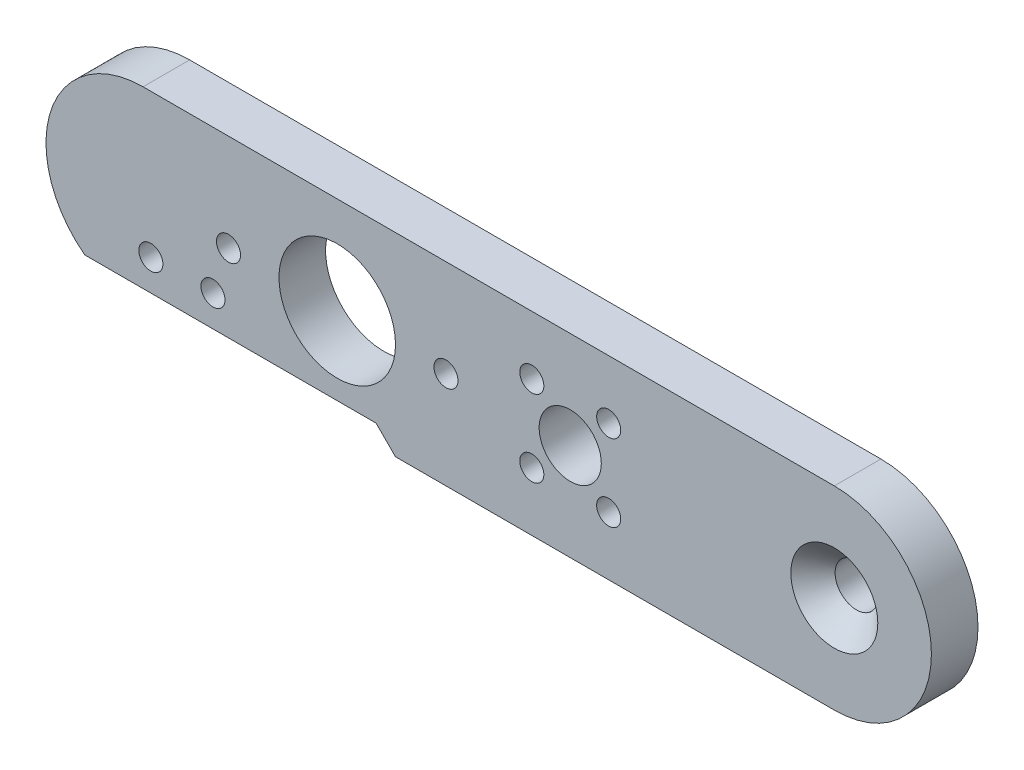
ISO-10303-21;
HEADER;
FILE_DESCRIPTION(('STEP AP214'),'2;1');
FILE_NAME('part.step','',(''),(''),'','','');
FILE_SCHEMA(('AUTOMOTIVE_DESIGN { 1 0 10303 214 1 1 1 1 }'));
ENDSEC;
DATA;
#1=APPLICATION_CONTEXT('core data for automotive mechanical design processes');
#2=APPLICATION_PROTOCOL_DEFINITION('international standard','automotive_design',2000,#1);
#3=PRODUCT_CONTEXT('',#1,'mechanical');
#4=PRODUCT('Part','Part','',(#3));
#5=PRODUCT_RELATED_PRODUCT_CATEGORY('part','',(#4));
#6=PRODUCT_DEFINITION_FORMATION('','',#4);
#7=PRODUCT_DEFINITION_CONTEXT('part definition',#1,'design');
#8=PRODUCT_DEFINITION('design','',#6,#7);
#9=PRODUCT_DEFINITION_SHAPE('','',#8);
#10=(LENGTH_UNIT() NAMED_UNIT(*) SI_UNIT(.MILLI.,.METRE.));
#11=(NAMED_UNIT(*) PLANE_ANGLE_UNIT() SI_UNIT($,.RADIAN.));
#12=(NAMED_UNIT(*) SI_UNIT($,.STERADIAN.) SOLID_ANGLE_UNIT());
#13=UNCERTAINTY_MEASURE_WITH_UNIT(LENGTH_MEASURE(1.E-05),#10,'distance_accuracy_value','');
#14=(GEOMETRIC_REPRESENTATION_CONTEXT(3) GLOBAL_UNCERTAINTY_ASSIGNED_CONTEXT((#13)) GLOBAL_UNIT_ASSIGNED_CONTEXT((#10,
#11,#12)) REPRESENTATION_CONTEXT('',''));
#15=CARTESIAN_POINT('',(0.,0.,0.));
#16=DIRECTION('',(0.,0.,1.));
#17=DIRECTION('',(1.,0.,0.));
#18=AXIS2_PLACEMENT_3D('',#15,#16,#17);
#19=CARTESIAN_POINT('',(-44.5692068429238,0.,6.));
#20=DIRECTION('',(0.,0.,1.));
#21=DIRECTION('',(1.,0.,0.));
#22=AXIS2_PLACEMENT_3D('',#19,#20,#21);
#23=PLANE('',#22);
#24=CARTESIAN_POINT('',(-35.5692068429238,-6.,6.));
#25=DIRECTION('',(0.,0.,1.));
#26=DIRECTION('',(1.,0.,0.));
#27=AXIS2_PLACEMENT_3D('',#24,#25,#26);
#28=CIRCLE('',#27,1.55);
#29=CARTESIAN_POINT('',(-34.0192068429238,-6.,6.));
#30=VERTEX_POINT('',#29);
#31=EDGE_CURVE('E247',#30,#30,#28,.T.);
#32=ORIENTED_EDGE('',*,*,#31,.F.);
#33=EDGE_LOOP('',(#32));
#34=FACE_BOUND('',#33,.T.);
#35=CARTESIAN_POINT('',(-43.5692068429238,-6.,6.));
#36=DIRECTION('',(0.,0.,1.));
#37=DIRECTION('',(1.,0.,0.));
#38=AXIS2_PLACEMENT_3D('',#35,#36,#37);
#39=CIRCLE('',#38,1.55);
#40=CARTESIAN_POINT('',(-42.0192068429238,-6.,6.));
#41=VERTEX_POINT('',#40);
#42=EDGE_CURVE('E251',#41,#41,#39,.T.);
#43=ORIENTED_EDGE('',*,*,#42,.F.);
#44=EDGE_LOOP('',(#43));
#45=FACE_BOUND('',#44,.T.);
#46=CARTESIAN_POINT('',(44.4307931570762,0.,6.));
#47=DIRECTION('',(0.,0.,1.));
#48=DIRECTION('',(1.,0.,0.));
#49=AXIS2_PLACEMENT_3D('',#46,#47,#48);
#50=CIRCLE('',#49,5.6);
#51=CARTESIAN_POINT('',(50.0307931570762,0.,6.));
#52=VERTEX_POINT('',#51);
#53=EDGE_CURVE('E250',#52,#52,#50,.T.);
#54=ORIENTED_EDGE('',*,*,#53,.F.);
#55=EDGE_LOOP('',(#54));
#56=FACE_BOUND('',#55,.T.);
#57=CARTESIAN_POINT('',(-5.56920684292381,0.,6.));
#58=DIRECTION('',(0.,0.,1.));
#59=DIRECTION('',(1.,0.,0.));
#60=AXIS2_PLACEMENT_3D('',#57,#58,#59);
#61=CIRCLE('',#60,1.55);
#62=CARTESIAN_POINT('',(-4.01920684292381,0.,6.));
#63=VERTEX_POINT('',#62);
#64=EDGE_CURVE('E271',#63,#63,#61,.T.);
#65=ORIENTED_EDGE('',*,*,#64,.F.);
#66=EDGE_LOOP('',(#65));
#67=FACE_BOUND('',#66,.T.);
#68=CARTESIAN_POINT('',(5.48104568877047,-4.94974746830595,6.));
#69=DIRECTION('',(0.,0.,1.));
#70=DIRECTION('',(1.,0.,0.));
#71=AXIS2_PLACEMENT_3D('',#68,#69,#70);
#72=CIRCLE('',#71,1.55);
#73=CARTESIAN_POINT('',(7.03104568877047,-4.94974746830595,6.));
#74=VERTEX_POINT('',#73);
#75=EDGE_CURVE('E283',#74,#74,#72,.T.);
#76=ORIENTED_EDGE('',*,*,#75,.F.);
#77=EDGE_LOOP('',(#76));
#78=FACE_BOUND('',#77,.T.);
#79=CARTESIAN_POINT('',(-19.5692068429238,0.,6.));
#80=DIRECTION('',(0.,0.,1.));
#81=DIRECTION('',(1.,0.,0.));
#82=AXIS2_PLACEMENT_3D('',#79,#80,#81);
#83=CIRCLE('',#82,7.5);
#84=CARTESIAN_POINT('',(-12.0692068429238,0.,6.));
#85=VERTEX_POINT('',#84);
#86=EDGE_CURVE('E295',#85,#85,#83,.T.);
#87=ORIENTED_EDGE('',*,*,#86,.F.);
#88=EDGE_LOOP('',(#87));
#89=FACE_BOUND('',#88,.T.);
#90=CARTESIAN_POINT('',(10.4307931570762,0.,6.));
#91=DIRECTION('',(0.,0.,1.));
#92=DIRECTION('',(1.,0.,0.));
#93=AXIS2_PLACEMENT_3D('',#90,#91,#92);
#94=CIRCLE('',#93,4.);
#95=CARTESIAN_POINT('',(14.4307931570762,0.,6.));
#96=VERTEX_POINT('',#95);
#97=EDGE_CURVE('E122',#96,#96,#94,.T.);
#98=ORIENTED_EDGE('',*,*,#97,.F.);
#99=EDGE_LOOP('',(#98));
#100=FACE_BOUND('',#99,.T.);
#101=CARTESIAN_POINT('',(-44.5692068429238,0.,6.));
#102=DIRECTION('',(0.,0.,1.));
#103=DIRECTION('',(1.,0.,0.));
#104=AXIS2_PLACEMENT_3D('',#101,#102,#103);
#105=CIRCLE('',#104,12.5);
#106=CARTESIAN_POINT('',(-44.5692068429238,12.5,6.));
#107=VERTEX_POINT('',#106);
#108=CARTESIAN_POINT('',(-52.0692068429238,-10.,6.));
#109=VERTEX_POINT('',#108);
#110=EDGE_CURVE('E129',#107,#109,#105,.T.);
#111=ORIENTED_EDGE('',*,*,#110,.T.);
#112=DIRECTION('',(1.,0.,0.));
#113=VECTOR('',#112,1.);
#114=CARTESIAN_POINT('',(-52.0692068429238,-10.,6.));
#115=LINE('',#114,#113);
#116=CARTESIAN_POINT('',(-14.5692068429238,-10.,6.));
#117=VERTEX_POINT('',#116);
#118=EDGE_CURVE('E87',#109,#117,#115,.T.);
#119=ORIENTED_EDGE('',*,*,#118,.T.);
#120=DIRECTION('',(0.707106781186548,-0.707106781186548,0.));
#121=VECTOR('',#120,1.);
#122=CARTESIAN_POINT('',(-14.5692068429238,-10.,6.));
#123=LINE('',#122,#121);
#124=CARTESIAN_POINT('',(-12.0692068429237,-12.5000000000001,6.));
#125=VERTEX_POINT('',#124);
#126=EDGE_CURVE('E100',#117,#125,#123,.T.);
#127=ORIENTED_EDGE('',*,*,#126,.T.);
#128=DIRECTION('',(1.,0.,0.));
#129=VECTOR('',#128,1.);
#130=CARTESIAN_POINT('',(-12.0692068429237,-12.5000000000001,6.));
#131=LINE('',#130,#129);
#132=CARTESIAN_POINT('',(44.4307931570762,-12.5,6.));
#133=VERTEX_POINT('',#132);
#134=EDGE_CURVE('E94',#125,#133,#131,.T.);
#135=ORIENTED_EDGE('',*,*,#134,.T.);
#136=CARTESIAN_POINT('',(44.4307931570762,0.,6.));
#137=DIRECTION('',(0.,0.,1.));
#138=DIRECTION('',(1.,0.,0.));
#139=AXIS2_PLACEMENT_3D('',#136,#137,#138);
#140=CIRCLE('',#139,12.5);
#141=CARTESIAN_POINT('',(44.4307931570762,12.5,6.));
#142=VERTEX_POINT('',#141);
#143=EDGE_CURVE('E98',#133,#142,#140,.T.);
#144=ORIENTED_EDGE('',*,*,#143,.T.);
#145=DIRECTION('',(-1.,0.,0.));
#146=VECTOR('',#145,1.);
#147=CARTESIAN_POINT('',(-44.5692068429238,12.5,6.));
#148=LINE('',#147,#146);
#149=EDGE_CURVE('E50',#142,#107,#148,.T.);
#150=ORIENTED_EDGE('',*,*,#149,.T.);
#151=EDGE_LOOP('',(#111,#119,#127,#135,#144,#150));
#152=FACE_BOUND('',#151,.T.);
#153=CARTESIAN_POINT('',(15.380540625382,4.94974746830584,6.));
#154=DIRECTION('',(0.,0.,1.));
#155=DIRECTION('',(1.,0.,0.));
#156=AXIS2_PLACEMENT_3D('',#153,#154,#155);
#157=CIRCLE('',#156,1.55);
#158=CARTESIAN_POINT('',(16.930540625382,4.94974746830584,6.));
#159=VERTEX_POINT('',#158);
#160=EDGE_CURVE('E301',#159,#159,#157,.T.);
#161=ORIENTED_EDGE('',*,*,#160,.F.);
#162=EDGE_LOOP('',(#161));
#163=FACE_BOUND('',#162,.T.);
#164=CARTESIAN_POINT('',(15.3805406253822,-4.94974746830584,6.));
#165=DIRECTION('',(0.,0.,1.));
#166=DIRECTION('',(1.,0.,0.));
#167=AXIS2_PLACEMENT_3D('',#164,#165,#166);
#168=CIRCLE('',#167,1.55);
#169=CARTESIAN_POINT('',(16.9305406253822,-4.94974746830584,6.));
#170=VERTEX_POINT('',#169);
#171=EDGE_CURVE('E289',#170,#170,#168,.T.);
#172=ORIENTED_EDGE('',*,*,#171,.F.);
#173=EDGE_LOOP('',(#172));
#174=FACE_BOUND('',#173,.T.);
#175=CARTESIAN_POINT('',(5.4810456887704,4.94974746830574,6.));
#176=DIRECTION('',(0.,0.,1.));
#177=DIRECTION('',(1.,0.,0.));
#178=AXIS2_PLACEMENT_3D('',#175,#176,#177);
#179=CIRCLE('',#178,1.55);
#180=CARTESIAN_POINT('',(7.0310456887704,4.94974746830574,6.));
#181=VERTEX_POINT('',#180);
#182=EDGE_CURVE('E277',#181,#181,#179,.T.);
#183=ORIENTED_EDGE('',*,*,#182,.F.);
#184=EDGE_LOOP('',(#183));
#185=FACE_BOUND('',#184,.T.);
#186=CARTESIAN_POINT('',(-33.5692068429238,0.,6.));
#187=DIRECTION('',(0.,0.,1.));
#188=DIRECTION('',(1.,0.,0.));
#189=AXIS2_PLACEMENT_3D('',#186,#187,#188);
#190=CIRCLE('',#189,1.55);
#191=CARTESIAN_POINT('',(-32.0192068429238,0.,6.));
#192=VERTEX_POINT('',#191);
#193=EDGE_CURVE('E265',#192,#192,#190,.T.);
#194=ORIENTED_EDGE('',*,*,#193,.F.);
#195=EDGE_LOOP('',(#194));
#196=FACE_BOUND('',#195,.T.);
#197=ADVANCED_FACE('F33',(#34,#45,#56,#67,#78,#89,#100,#152,#163,#174,#185,#196),#23,.T.);
#198=CARTESIAN_POINT('',(-44.5692068429238,0.,0.));
#199=DIRECTION('',(0.,0.,1.));
#200=DIRECTION('',(1.,0.,0.));
#201=AXIS2_PLACEMENT_3D('',#198,#199,#200);
#202=PLANE('',#201);
#203=CARTESIAN_POINT('',(-35.5692068429238,-6.,0.));
#204=DIRECTION('',(0.,0.,1.));
#205=DIRECTION('',(1.,0.,0.));
#206=AXIS2_PLACEMENT_3D('',#203,#204,#205);
#207=CIRCLE('',#206,3.);
#208=CARTESIAN_POINT('',(-32.5692068429238,-6.,0.));
#209=VERTEX_POINT('',#208);
#210=EDGE_CURVE('E234',#209,#209,#207,.T.);
#211=ORIENTED_EDGE('',*,*,#210,.T.);
#212=EDGE_LOOP('',(#211));
#213=FACE_BOUND('',#212,.T.);
#214=CARTESIAN_POINT('',(-43.5692068429238,-6.,0.));
#215=DIRECTION('',(0.,0.,1.));
#216=DIRECTION('',(1.,0.,0.));
#217=AXIS2_PLACEMENT_3D('',#214,#215,#216);
#218=CIRCLE('',#217,3.);
#219=CARTESIAN_POINT('',(-40.5692068429238,-6.,0.));
#220=VERTEX_POINT('',#219);
#221=EDGE_CURVE('E235',#220,#220,#218,.T.);
#222=ORIENTED_EDGE('',*,*,#221,.T.);
#223=EDGE_LOOP('',(#222));
#224=FACE_BOUND('',#223,.T.);
#225=CARTESIAN_POINT('',(44.4307931570762,0.,0.));
#226=DIRECTION('',(0.,0.,1.));
#227=DIRECTION('',(1.,0.,0.));
#228=AXIS2_PLACEMENT_3D('',#225,#226,#227);
#229=CIRCLE('',#228,2.75);
#230=CARTESIAN_POINT('',(47.1807931570762,0.,0.));
#231=VERTEX_POINT('',#230);
#232=EDGE_CURVE('E261',#231,#231,#229,.T.);
#233=ORIENTED_EDGE('',*,*,#232,.T.);
#234=EDGE_LOOP('',(#233));
#235=FACE_BOUND('',#234,.T.);
#236=CARTESIAN_POINT('',(-44.5692068429238,0.,0.));
#237=DIRECTION('',(0.,0.,1.));
#238=DIRECTION('',(1.,0.,0.));
#239=AXIS2_PLACEMENT_3D('',#236,#237,#238);
#240=CIRCLE('',#239,12.5);
#241=CARTESIAN_POINT('',(-44.5692068429238,12.5,0.));
#242=VERTEX_POINT('',#241);
#243=CARTESIAN_POINT('',(-52.0692068429238,-10.,0.));
#244=VERTEX_POINT('',#243);
#245=EDGE_CURVE('E118',#242,#244,#240,.T.);
#246=ORIENTED_EDGE('',*,*,#245,.F.);
#247=DIRECTION('',(-1.,0.,0.));
#248=VECTOR('',#247,1.);
#249=CARTESIAN_POINT('',(-44.5692068429238,12.5,0.));
#250=LINE('',#249,#248);
#251=CARTESIAN_POINT('',(44.4307931570762,12.5,0.));
#252=VERTEX_POINT('',#251);
#253=EDGE_CURVE('E79',#252,#242,#250,.T.);
#254=ORIENTED_EDGE('',*,*,#253,.F.);
#255=CARTESIAN_POINT('',(44.4307931570762,0.,0.));
#256=DIRECTION('',(0.,0.,1.));
#257=DIRECTION('',(1.,0.,0.));
#258=AXIS2_PLACEMENT_3D('',#255,#256,#257);
#259=CIRCLE('',#258,12.5);
#260=CARTESIAN_POINT('',(44.4307931570762,-12.5,0.));
#261=VERTEX_POINT('',#260);
#262=EDGE_CURVE('E73',#261,#252,#259,.T.);
#263=ORIENTED_EDGE('',*,*,#262,.F.);
#264=DIRECTION('',(1.,0.,0.));
#265=VECTOR('',#264,1.);
#266=CARTESIAN_POINT('',(-12.0692068429237,-12.5000000000001,0.));
#267=LINE('',#266,#265);
#268=CARTESIAN_POINT('',(-12.0692068429237,-12.5000000000001,0.));
#269=VERTEX_POINT('',#268);
#270=EDGE_CURVE('E108',#269,#261,#267,.T.);
#271=ORIENTED_EDGE('',*,*,#270,.F.);
#272=DIRECTION('',(0.707106781186548,-0.707106781186548,0.));
#273=VECTOR('',#272,1.);
#274=CARTESIAN_POINT('',(-14.5692068429238,-10.,0.));
#275=LINE('',#274,#273);
#276=CARTESIAN_POINT('',(-14.5692068429238,-10.,0.));
#277=VERTEX_POINT('',#276);
#278=EDGE_CURVE('E124',#277,#269,#275,.T.);
#279=ORIENTED_EDGE('',*,*,#278,.F.);
#280=DIRECTION('',(1.,0.,0.));
#281=VECTOR('',#280,1.);
#282=CARTESIAN_POINT('',(-52.0692068429238,-10.,0.));
#283=LINE('',#282,#281);
#284=EDGE_CURVE('E121',#244,#277,#283,.T.);
#285=ORIENTED_EDGE('',*,*,#284,.F.);
#286=EDGE_LOOP('',(#246,#254,#263,#271,#279,#285));
#287=FACE_BOUND('',#286,.T.);
#288=CARTESIAN_POINT('',(10.4307931570762,0.,0.));
#289=DIRECTION('',(0.,0.,1.));
#290=DIRECTION('',(1.,0.,0.));
#291=AXIS2_PLACEMENT_3D('',#288,#289,#290);
#292=CIRCLE('',#291,4.);
#293=CARTESIAN_POINT('',(14.4307931570762,0.,0.));
#294=VERTEX_POINT('',#293);
#295=EDGE_CURVE('E304',#294,#294,#292,.T.);
#296=ORIENTED_EDGE('',*,*,#295,.T.);
#297=EDGE_LOOP('',(#296));
#298=FACE_BOUND('',#297,.T.);
#299=CARTESIAN_POINT('',(15.380540625382,4.94974746830584,0.));
#300=DIRECTION('',(0.,0.,1.));
#301=DIRECTION('',(1.,0.,0.));
#302=AXIS2_PLACEMENT_3D('',#299,#300,#301);
#303=CIRCLE('',#302,1.55);
#304=CARTESIAN_POINT('',(16.930540625382,4.94974746830584,0.));
#305=VERTEX_POINT('',#304);
#306=EDGE_CURVE('E298',#305,#305,#303,.T.);
#307=ORIENTED_EDGE('',*,*,#306,.T.);
#308=EDGE_LOOP('',(#307));
#309=FACE_BOUND('',#308,.T.);
#310=CARTESIAN_POINT('',(-19.5692068429238,0.,0.));
#311=DIRECTION('',(0.,0.,1.));
#312=DIRECTION('',(1.,0.,0.));
#313=AXIS2_PLACEMENT_3D('',#310,#311,#312);
#314=CIRCLE('',#313,7.5);
#315=CARTESIAN_POINT('',(-12.0692068429238,0.,0.));
#316=VERTEX_POINT('',#315);
#317=EDGE_CURVE('E292',#316,#316,#314,.T.);
#318=ORIENTED_EDGE('',*,*,#317,.T.);
#319=EDGE_LOOP('',(#318));
#320=FACE_BOUND('',#319,.T.);
#321=CARTESIAN_POINT('',(15.3805406253822,-4.94974746830584,0.));
#322=DIRECTION('',(0.,0.,1.));
#323=DIRECTION('',(1.,0.,0.));
#324=AXIS2_PLACEMENT_3D('',#321,#322,#323);
#325=CIRCLE('',#324,1.55);
#326=CARTESIAN_POINT('',(16.9305406253822,-4.94974746830584,0.));
#327=VERTEX_POINT('',#326);
#328=EDGE_CURVE('E286',#327,#327,#325,.T.);
#329=ORIENTED_EDGE('',*,*,#328,.T.);
#330=EDGE_LOOP('',(#329));
#331=FACE_BOUND('',#330,.T.);
#332=CARTESIAN_POINT('',(5.48104568877047,-4.94974746830595,0.));
#333=DIRECTION('',(0.,0.,1.));
#334=DIRECTION('',(1.,0.,0.));
#335=AXIS2_PLACEMENT_3D('',#332,#333,#334);
#336=CIRCLE('',#335,1.55);
#337=CARTESIAN_POINT('',(7.03104568877047,-4.94974746830595,0.));
#338=VERTEX_POINT('',#337);
#339=EDGE_CURVE('E280',#338,#338,#336,.T.);
#340=ORIENTED_EDGE('',*,*,#339,.T.);
#341=EDGE_LOOP('',(#340));
#342=FACE_BOUND('',#341,.T.);
#343=CARTESIAN_POINT('',(5.4810456887704,4.94974746830574,0.));
#344=DIRECTION('',(0.,0.,1.));
#345=DIRECTION('',(1.,0.,0.));
#346=AXIS2_PLACEMENT_3D('',#343,#344,#345);
#347=CIRCLE('',#346,1.55);
#348=CARTESIAN_POINT('',(7.0310456887704,4.94974746830574,0.));
#349=VERTEX_POINT('',#348);
#350=EDGE_CURVE('E274',#349,#349,#347,.T.);
#351=ORIENTED_EDGE('',*,*,#350,.T.);
#352=EDGE_LOOP('',(#351));
#353=FACE_BOUND('',#352,.T.);
#354=CARTESIAN_POINT('',(-5.56920684292381,0.,0.));
#355=DIRECTION('',(0.,0.,1.));
#356=DIRECTION('',(1.,0.,0.));
#357=AXIS2_PLACEMENT_3D('',#354,#355,#356);
#358=CIRCLE('',#357,1.55);
#359=CARTESIAN_POINT('',(-4.01920684292381,0.,0.));
#360=VERTEX_POINT('',#359);
#361=EDGE_CURVE('E268',#360,#360,#358,.T.);
#362=ORIENTED_EDGE('',*,*,#361,.T.);
#363=EDGE_LOOP('',(#362));
#364=FACE_BOUND('',#363,.T.);
#365=CARTESIAN_POINT('',(-33.5692068429238,0.,0.));
#366=DIRECTION('',(0.,0.,1.));
#367=DIRECTION('',(1.,0.,0.));
#368=AXIS2_PLACEMENT_3D('',#365,#366,#367);
#369=CIRCLE('',#368,1.55);
#370=CARTESIAN_POINT('',(-32.0192068429238,0.,0.));
#371=VERTEX_POINT('',#370);
#372=EDGE_CURVE('E264',#371,#371,#369,.T.);
#373=ORIENTED_EDGE('',*,*,#372,.T.);
#374=EDGE_LOOP('',(#373));
#375=FACE_BOUND('',#374,.T.);
#376=ADVANCED_FACE('F138',(#213,#224,#235,#287,#298,#309,#320,#331,#342,#353,#364,#375),#202,.F.);
#377=CARTESIAN_POINT('',(-44.5692068429238,0.,6.));
#378=DIRECTION('',(0.,0.,-1.));
#379=DIRECTION('',(-1.,0.,0.));
#380=AXIS2_PLACEMENT_3D('',#377,#378,#379);
#381=CYLINDRICAL_SURFACE('',#380,12.5);
#382=ORIENTED_EDGE('',*,*,#245,.T.);
#383=DIRECTION('',(0.,0.,-1.));
#384=VECTOR('',#383,1.);
#385=CARTESIAN_POINT('',(-52.0692068429238,-10.,6.));
#386=LINE('',#385,#384);
#387=EDGE_CURVE('E11',#109,#244,#386,.T.);
#388=ORIENTED_EDGE('',*,*,#387,.F.);
#389=ORIENTED_EDGE('',*,*,#110,.F.);
#390=DIRECTION('',(0.,0.,-1.));
#391=VECTOR('',#390,1.);
#392=CARTESIAN_POINT('',(-44.5692068429238,12.5,6.));
#393=LINE('',#392,#391);
#394=EDGE_CURVE('E114',#107,#242,#393,.T.);
#395=ORIENTED_EDGE('',*,*,#394,.T.);
#396=EDGE_LOOP('',(#382,#388,#389,#395));
#397=FACE_BOUND('',#396,.T.);
#398=ADVANCED_FACE('F35',(#397),#381,.T.);
#399=CARTESIAN_POINT('',(-52.0692068429238,-10.,6.));
#400=DIRECTION('',(0.,1.,0.));
#401=DIRECTION('',(0.,0.,1.));
#402=AXIS2_PLACEMENT_3D('',#399,#400,#401);
#403=PLANE('',#402);
#404=ORIENTED_EDGE('',*,*,#284,.T.);
#405=DIRECTION('',(0.,0.,-1.));
#406=VECTOR('',#405,1.);
#407=CARTESIAN_POINT('',(-14.5692068429238,-10.,6.));
#408=LINE('',#407,#406);
#409=EDGE_CURVE('E42',#117,#277,#408,.T.);
#410=ORIENTED_EDGE('',*,*,#409,.F.);
#411=ORIENTED_EDGE('',*,*,#118,.F.);
#412=ORIENTED_EDGE('',*,*,#387,.T.);
#413=EDGE_LOOP('',(#404,#410,#411,#412));
#414=FACE_BOUND('',#413,.T.);
#415=ADVANCED_FACE('F455',(#414),#403,.F.);
#416=CARTESIAN_POINT('',(-14.5692068429238,-10.,6.));
#417=DIRECTION('',(0.707106781186547,0.707106781186547,0.));
#418=DIRECTION('',(-0.707106781186548,0.707106781186548,0.));
#419=AXIS2_PLACEMENT_3D('',#416,#417,#418);
#420=PLANE('',#419);
#421=ORIENTED_EDGE('',*,*,#278,.T.);
#422=DIRECTION('',(0.,0.,-1.));
#423=VECTOR('',#422,1.);
#424=CARTESIAN_POINT('',(-12.0692068429237,-12.5000000000001,6.));
#425=LINE('',#424,#423);
#426=EDGE_CURVE('E109',#125,#269,#425,.T.);
#427=ORIENTED_EDGE('',*,*,#426,.F.);
#428=ORIENTED_EDGE('',*,*,#126,.F.);
#429=ORIENTED_EDGE('',*,*,#409,.T.);
#430=EDGE_LOOP('',(#421,#427,#428,#429));
#431=FACE_BOUND('',#430,.T.);
#432=ADVANCED_FACE('F135',(#431),#420,.F.);
#433=CARTESIAN_POINT('',(-12.0692068429237,-12.5000000000001,6.));
#434=DIRECTION('',(0.,1.,0.));
#435=DIRECTION('',(-1.,0.,0.));
#436=AXIS2_PLACEMENT_3D('',#433,#434,#435);
#437=PLANE('',#436);
#438=ORIENTED_EDGE('',*,*,#270,.T.);
#439=DIRECTION('',(0.,0.,-1.));
#440=VECTOR('',#439,1.);
#441=CARTESIAN_POINT('',(44.4307931570762,-12.5,6.));
#442=LINE('',#441,#440);
#443=EDGE_CURVE('E105',#133,#261,#442,.T.);
#444=ORIENTED_EDGE('',*,*,#443,.F.);
#445=ORIENTED_EDGE('',*,*,#134,.F.);
#446=ORIENTED_EDGE('',*,*,#426,.T.);
#447=EDGE_LOOP('',(#438,#444,#445,#446));
#448=FACE_BOUND('',#447,.T.);
#449=ADVANCED_FACE('F106',(#448),#437,.F.);
#450=CARTESIAN_POINT('',(44.4307931570762,0.,6.));
#451=DIRECTION('',(0.,0.,-1.));
#452=DIRECTION('',(-1.,0.,0.));
#453=AXIS2_PLACEMENT_3D('',#450,#451,#452);
#454=CYLINDRICAL_SURFACE('',#453,12.5);
#455=ORIENTED_EDGE('',*,*,#262,.T.);
#456=DIRECTION('',(0.,0.,-1.));
#457=VECTOR('',#456,1.);
#458=CARTESIAN_POINT('',(44.4307931570762,12.5,6.));
#459=LINE('',#458,#457);
#460=EDGE_CURVE('E110',#142,#252,#459,.T.);
#461=ORIENTED_EDGE('',*,*,#460,.F.);
#462=ORIENTED_EDGE('',*,*,#143,.F.);
#463=ORIENTED_EDGE('',*,*,#443,.T.);
#464=EDGE_LOOP('',(#455,#461,#462,#463));
#465=FACE_BOUND('',#464,.T.);
#466=ADVANCED_FACE('F112',(#465),#454,.T.);
#467=CARTESIAN_POINT('',(-44.5692068429238,12.5,6.));
#468=DIRECTION('',(0.,-1.,0.));
#469=DIRECTION('',(0.,0.,-1.));
#470=AXIS2_PLACEMENT_3D('',#467,#468,#469);
#471=PLANE('',#470);
#472=ORIENTED_EDGE('',*,*,#253,.T.);
#473=ORIENTED_EDGE('',*,*,#394,.F.);
#474=ORIENTED_EDGE('',*,*,#149,.F.);
#475=ORIENTED_EDGE('',*,*,#460,.T.);
#476=EDGE_LOOP('',(#472,#473,#474,#475));
#477=FACE_BOUND('',#476,.T.);
#478=ADVANCED_FACE('F143',(#477),#471,.F.);
#479=CARTESIAN_POINT('',(10.4307931570762,0.,6.));
#480=DIRECTION('',(0.,0.,-1.));
#481=DIRECTION('',(-1.,0.,0.));
#482=AXIS2_PLACEMENT_3D('',#479,#480,#481);
#483=CYLINDRICAL_SURFACE('',#482,4.);
#484=ORIENTED_EDGE('',*,*,#97,.T.);
#485=EDGE_LOOP('',(#484));
#486=FACE_BOUND('',#485,.T.);
#487=ORIENTED_EDGE('',*,*,#295,.F.);
#488=EDGE_LOOP('',(#487));
#489=FACE_BOUND('',#488,.T.);
#490=ADVANCED_FACE('F145',(#486,#489),#483,.F.);
#491=CARTESIAN_POINT('',(15.380540625382,4.94974746830584,6.));
#492=DIRECTION('',(0.,0.,-1.));
#493=DIRECTION('',(-1.,0.,0.));
#494=AXIS2_PLACEMENT_3D('',#491,#492,#493);
#495=CYLINDRICAL_SURFACE('',#494,1.55);
#496=ORIENTED_EDGE('',*,*,#160,.T.);
#497=EDGE_LOOP('',(#496));
#498=FACE_BOUND('',#497,.T.);
#499=ORIENTED_EDGE('',*,*,#306,.F.);
#500=EDGE_LOOP('',(#499));
#501=FACE_BOUND('',#500,.T.);
#502=ADVANCED_FACE('F151',(#498,#501),#495,.F.);
#503=CARTESIAN_POINT('',(-19.5692068429238,0.,6.));
#504=DIRECTION('',(0.,0.,-1.));
#505=DIRECTION('',(-1.,0.,0.));
#506=AXIS2_PLACEMENT_3D('',#503,#504,#505);
#507=CYLINDRICAL_SURFACE('',#506,7.5);
#508=ORIENTED_EDGE('',*,*,#86,.T.);
#509=EDGE_LOOP('',(#508));
#510=FACE_BOUND('',#509,.T.);
#511=ORIENTED_EDGE('',*,*,#317,.F.);
#512=EDGE_LOOP('',(#511));
#513=FACE_BOUND('',#512,.T.);
#514=ADVANCED_FACE('F168',(#510,#513),#507,.F.);
#515=CARTESIAN_POINT('',(15.3805406253822,-4.94974746830584,6.));
#516=DIRECTION('',(0.,0.,-1.));
#517=DIRECTION('',(-1.,0.,0.));
#518=AXIS2_PLACEMENT_3D('',#515,#516,#517);
#519=CYLINDRICAL_SURFACE('',#518,1.55);
#520=ORIENTED_EDGE('',*,*,#171,.T.);
#521=EDGE_LOOP('',(#520));
#522=FACE_BOUND('',#521,.T.);
#523=ORIENTED_EDGE('',*,*,#328,.F.);
#524=EDGE_LOOP('',(#523));
#525=FACE_BOUND('',#524,.T.);
#526=ADVANCED_FACE('F172',(#522,#525),#519,.F.);
#527=CARTESIAN_POINT('',(5.48104568877047,-4.94974746830595,6.));
#528=DIRECTION('',(0.,0.,-1.));
#529=DIRECTION('',(-1.,0.,0.));
#530=AXIS2_PLACEMENT_3D('',#527,#528,#529);
#531=CYLINDRICAL_SURFACE('',#530,1.55);
#532=ORIENTED_EDGE('',*,*,#75,.T.);
#533=EDGE_LOOP('',(#532));
#534=FACE_BOUND('',#533,.T.);
#535=ORIENTED_EDGE('',*,*,#339,.F.);
#536=EDGE_LOOP('',(#535));
#537=FACE_BOUND('',#536,.T.);
#538=ADVANCED_FACE('F176',(#534,#537),#531,.F.);
#539=CARTESIAN_POINT('',(5.4810456887704,4.94974746830574,6.));
#540=DIRECTION('',(0.,0.,-1.));
#541=DIRECTION('',(-1.,0.,0.));
#542=AXIS2_PLACEMENT_3D('',#539,#540,#541);
#543=CYLINDRICAL_SURFACE('',#542,1.55);
#544=ORIENTED_EDGE('',*,*,#182,.T.);
#545=EDGE_LOOP('',(#544));
#546=FACE_BOUND('',#545,.T.);
#547=ORIENTED_EDGE('',*,*,#350,.F.);
#548=EDGE_LOOP('',(#547));
#549=FACE_BOUND('',#548,.T.);
#550=ADVANCED_FACE('F180',(#546,#549),#543,.F.);
#551=CARTESIAN_POINT('',(-5.56920684292381,0.,6.));
#552=DIRECTION('',(0.,0.,-1.));
#553=DIRECTION('',(-1.,0.,0.));
#554=AXIS2_PLACEMENT_3D('',#551,#552,#553);
#555=CYLINDRICAL_SURFACE('',#554,1.55);
#556=ORIENTED_EDGE('',*,*,#64,.T.);
#557=EDGE_LOOP('',(#556));
#558=FACE_BOUND('',#557,.T.);
#559=ORIENTED_EDGE('',*,*,#361,.F.);
#560=EDGE_LOOP('',(#559));
#561=FACE_BOUND('',#560,.T.);
#562=ADVANCED_FACE('F184',(#558,#561),#555,.F.);
#563=CARTESIAN_POINT('',(-33.5692068429238,0.,6.));
#564=DIRECTION('',(0.,0.,-1.));
#565=DIRECTION('',(-1.,0.,0.));
#566=AXIS2_PLACEMENT_3D('',#563,#564,#565);
#567=CYLINDRICAL_SURFACE('',#566,1.55);
#568=ORIENTED_EDGE('',*,*,#193,.T.);
#569=EDGE_LOOP('',(#568));
#570=FACE_BOUND('',#569,.T.);
#571=ORIENTED_EDGE('',*,*,#372,.F.);
#572=EDGE_LOOP('',(#571));
#573=FACE_BOUND('',#572,.T.);
#574=ADVANCED_FACE('F188',(#570,#573),#567,.F.);
#575=CARTESIAN_POINT('',(44.4307931570762,0.,6.));
#576=DIRECTION('',(0.,0.,1.));
#577=DIRECTION('',(1.,0.,0.));
#578=AXIS2_PLACEMENT_3D('',#575,#576,#577);
#579=CYLINDRICAL_SURFACE('',#578,2.75);
#580=ORIENTED_EDGE('',*,*,#232,.F.);
#581=EDGE_LOOP('',(#580));
#582=FACE_BOUND('',#581,.T.);
#583=CARTESIAN_POINT('',(44.4307931570762,0.,3.15));
#584=DIRECTION('',(0.,0.,1.));
#585=DIRECTION('',(1.,0.,0.));
#586=AXIS2_PLACEMENT_3D('',#583,#584,#585);
#587=CIRCLE('',#586,2.75);
#588=CARTESIAN_POINT('',(47.1807931570762,0.,3.15));
#589=VERTEX_POINT('',#588);
#590=EDGE_CURVE('E258',#589,#589,#587,.T.);
#591=ORIENTED_EDGE('',*,*,#590,.T.);
#592=EDGE_LOOP('',(#591));
#593=FACE_BOUND('',#592,.T.);
#594=ADVANCED_FACE('F192',(#582,#593),#579,.F.);
#595=CARTESIAN_POINT('',(44.4307931570762,0.,6.));
#596=DIRECTION('',(0.,0.,1.));
#597=DIRECTION('',(1.,0.,0.));
#598=AXIS2_PLACEMENT_3D('',#595,#596,#597);
#599=CONICAL_SURFACE('',#598,5.6,0.785398163397448);
#600=ORIENTED_EDGE('',*,*,#590,.F.);
#601=EDGE_LOOP('',(#600));
#602=FACE_BOUND('',#601,.T.);
#603=ORIENTED_EDGE('',*,*,#53,.T.);
#604=EDGE_LOOP('',(#603));
#605=FACE_BOUND('',#604,.T.);
#606=ADVANCED_FACE('F196',(#602,#605),#599,.F.);
#607=CARTESIAN_POINT('',(-43.5692068429238,-6.,3.));
#608=DIRECTION('',(0.,0.,1.));
#609=DIRECTION('',(1.,0.,0.));
#610=AXIS2_PLACEMENT_3D('',#607,#608,#609);
#611=CYLINDRICAL_SURFACE('',#610,1.55);
#612=CARTESIAN_POINT('',(-43.5692068429238,-6.,3.));
#613=DIRECTION('',(0.,0.,1.));
#614=DIRECTION('',(1.,0.,0.));
#615=AXIS2_PLACEMENT_3D('',#612,#613,#614);
#616=CIRCLE('',#615,1.55);
#617=CARTESIAN_POINT('',(-42.0192068429238,-6.,3.));
#618=VERTEX_POINT('',#617);
#619=EDGE_CURVE('E246',#618,#618,#616,.T.);
#620=ORIENTED_EDGE('',*,*,#619,.F.);
#621=EDGE_LOOP('',(#620));
#622=FACE_BOUND('',#621,.T.);
#623=ORIENTED_EDGE('',*,*,#42,.T.);
#624=EDGE_LOOP('',(#623));
#625=FACE_BOUND('',#624,.T.);
#626=ADVANCED_FACE('F200',(#622,#625),#611,.F.);
#627=CARTESIAN_POINT('',(-35.5692068429238,-6.,3.));
#628=DIRECTION('',(0.,0.,1.));
#629=DIRECTION('',(1.,0.,0.));
#630=AXIS2_PLACEMENT_3D('',#627,#628,#629);
#631=CYLINDRICAL_SURFACE('',#630,1.55);
#632=CARTESIAN_POINT('',(-35.5692068429238,-6.,3.));
#633=DIRECTION('',(0.,0.,1.));
#634=DIRECTION('',(1.,0.,0.));
#635=AXIS2_PLACEMENT_3D('',#632,#633,#634);
#636=CIRCLE('',#635,1.55);
#637=CARTESIAN_POINT('',(-34.0192068429238,-6.,3.));
#638=VERTEX_POINT('',#637);
#639=EDGE_CURVE('E229',#638,#638,#636,.T.);
#640=ORIENTED_EDGE('',*,*,#639,.F.);
#641=EDGE_LOOP('',(#640));
#642=FACE_BOUND('',#641,.T.);
#643=ORIENTED_EDGE('',*,*,#31,.T.);
#644=EDGE_LOOP('',(#643));
#645=FACE_BOUND('',#644,.T.);
#646=ADVANCED_FACE('F204',(#642,#645),#631,.F.);
#647=CARTESIAN_POINT('',(-43.5692068429238,-6.,0.));
#648=DIRECTION('',(0.,0.,1.));
#649=DIRECTION('',(1.,0.,0.));
#650=AXIS2_PLACEMENT_3D('',#647,#648,#649);
#651=CYLINDRICAL_SURFACE('',#650,3.);
#652=ORIENTED_EDGE('',*,*,#221,.F.);
#653=EDGE_LOOP('',(#652));
#654=FACE_BOUND('',#653,.T.);
#655=CARTESIAN_POINT('',(-43.5692068429238,-6.,3.));
#656=DIRECTION('',(0.,0.,1.));
#657=DIRECTION('',(1.,0.,0.));
#658=AXIS2_PLACEMENT_3D('',#655,#656,#657);
#659=CIRCLE('',#658,3.);
#660=CARTESIAN_POINT('',(-40.5692068429238,-6.,3.));
#661=VERTEX_POINT('',#660);
#662=EDGE_CURVE('E240',#661,#661,#659,.T.);
#663=ORIENTED_EDGE('',*,*,#662,.T.);
#664=EDGE_LOOP('',(#663));
#665=FACE_BOUND('',#664,.T.);
#666=ADVANCED_FACE('F208',(#654,#665),#651,.F.);
#667=CARTESIAN_POINT('',(-43.5692068429238,-6.,3.));
#668=DIRECTION('',(0.,0.,1.));
#669=DIRECTION('',(1.,0.,0.));
#670=AXIS2_PLACEMENT_3D('',#667,#668,#669);
#671=PLANE('',#670);
#672=ORIENTED_EDGE('',*,*,#619,.T.);
#673=EDGE_LOOP('',(#672));
#674=FACE_BOUND('',#673,.T.);
#675=ORIENTED_EDGE('',*,*,#662,.F.);
#676=EDGE_LOOP('',(#675));
#677=FACE_BOUND('',#676,.T.);
#678=ADVANCED_FACE('F212',(#674,#677),#671,.F.);
#679=CARTESIAN_POINT('',(-35.5692068429238,-6.,0.));
#680=DIRECTION('',(0.,0.,1.));
#681=DIRECTION('',(1.,0.,0.));
#682=AXIS2_PLACEMENT_3D('',#679,#680,#681);
#683=CYLINDRICAL_SURFACE('',#682,3.);
#684=ORIENTED_EDGE('',*,*,#210,.F.);
#685=EDGE_LOOP('',(#684));
#686=FACE_BOUND('',#685,.T.);
#687=CARTESIAN_POINT('',(-35.5692068429238,-6.,3.));
#688=DIRECTION('',(0.,0.,1.));
#689=DIRECTION('',(1.,0.,0.));
#690=AXIS2_PLACEMENT_3D('',#687,#688,#689);
#691=CIRCLE('',#690,3.);
#692=CARTESIAN_POINT('',(-32.5692068429238,-6.,3.));
#693=VERTEX_POINT('',#692);
#694=EDGE_CURVE('E232',#693,#693,#691,.T.);
#695=ORIENTED_EDGE('',*,*,#694,.T.);
#696=EDGE_LOOP('',(#695));
#697=FACE_BOUND('',#696,.T.);
#698=ADVANCED_FACE('F216',(#686,#697),#683,.F.);
#699=CARTESIAN_POINT('',(-35.5692068429238,-6.,3.));
#700=DIRECTION('',(0.,0.,1.));
#701=DIRECTION('',(1.,0.,0.));
#702=AXIS2_PLACEMENT_3D('',#699,#700,#701);
#703=PLANE('',#702);
#704=ORIENTED_EDGE('',*,*,#639,.T.);
#705=EDGE_LOOP('',(#704));
#706=FACE_BOUND('',#705,.T.);
#707=ORIENTED_EDGE('',*,*,#694,.F.);
#708=EDGE_LOOP('',(#707));
#709=FACE_BOUND('',#708,.T.);
#710=ADVANCED_FACE('F220',(#706,#709),#703,.F.);
#711=CLOSED_SHELL('',(#197,#376,#398,#415,#432,#449,#466,#478,#490,#502,#514,#526,#538,#550,
#562,#574,#594,#606,#626,#646,#666,#678,#698,#710));
#712=MANIFOLD_SOLID_BREP('B2',#711);
#713=ADVANCED_BREP_SHAPE_REPRESENTATION('',(#18,#712),#14);
#714=SHAPE_DEFINITION_REPRESENTATION(#9,#713);
ENDSEC;
END-ISO-10303-21;
